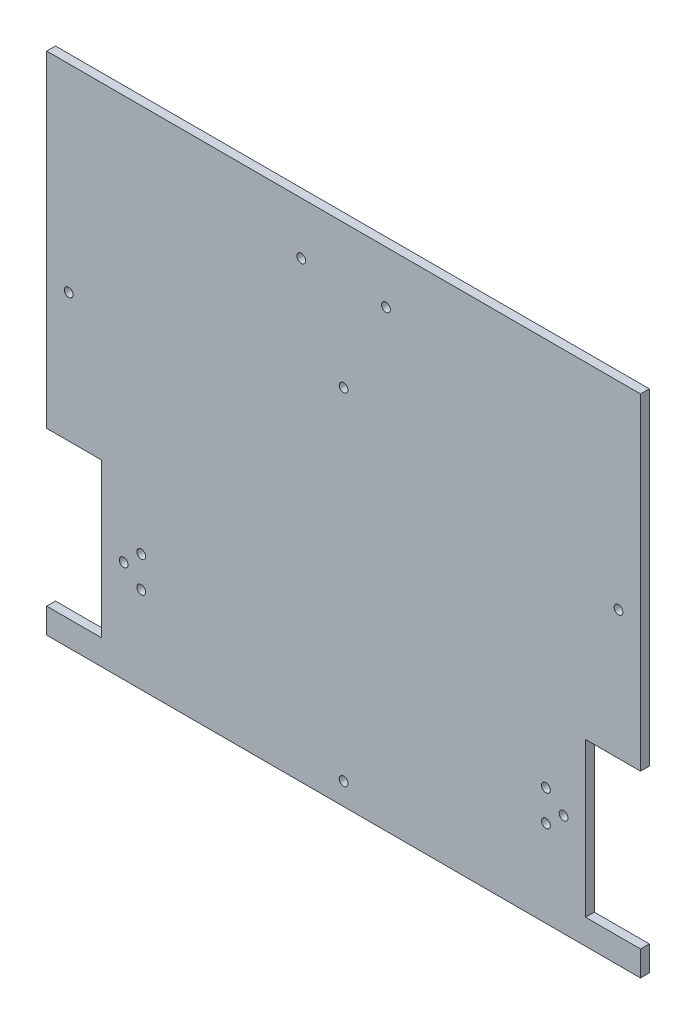
ISO-10303-21;
HEADER;
FILE_DESCRIPTION(('STEP AP214'),'2;1');
FILE_NAME('part.step','',(''),(''),'','','');
FILE_SCHEMA(('AUTOMOTIVE_DESIGN { 1 0 10303 214 1 1 1 1 }'));
ENDSEC;
DATA;
#1=APPLICATION_CONTEXT('core data for automotive mechanical design processes');
#2=APPLICATION_PROTOCOL_DEFINITION('international standard','automotive_design',2000,#1);
#3=PRODUCT_CONTEXT('',#1,'mechanical');
#4=PRODUCT('Part','Part','',(#3));
#5=PRODUCT_RELATED_PRODUCT_CATEGORY('part','',(#4));
#6=PRODUCT_DEFINITION_FORMATION('','',#4);
#7=PRODUCT_DEFINITION_CONTEXT('part definition',#1,'design');
#8=PRODUCT_DEFINITION('design','',#6,#7);
#9=PRODUCT_DEFINITION_SHAPE('','',#8);
#10=(LENGTH_UNIT() NAMED_UNIT(*) SI_UNIT(.MILLI.,.METRE.));
#11=(NAMED_UNIT(*) PLANE_ANGLE_UNIT() SI_UNIT($,.RADIAN.));
#12=(NAMED_UNIT(*) SI_UNIT($,.STERADIAN.) SOLID_ANGLE_UNIT());
#13=UNCERTAINTY_MEASURE_WITH_UNIT(LENGTH_MEASURE(1.E-05),#10,'distance_accuracy_value','');
#14=(GEOMETRIC_REPRESENTATION_CONTEXT(3) GLOBAL_UNCERTAINTY_ASSIGNED_CONTEXT((#13)) GLOBAL_UNIT_ASSIGNED_CONTEXT((#10,
#11,#12)) REPRESENTATION_CONTEXT('',''));
#15=CARTESIAN_POINT('',(0.,0.,0.));
#16=DIRECTION('',(0.,0.,1.));
#17=DIRECTION('',(1.,0.,0.));
#18=AXIS2_PLACEMENT_3D('',#15,#16,#17);
#19=CARTESIAN_POINT('',(135.,0.,4.));
#20=DIRECTION('',(-1.,0.,0.));
#21=DIRECTION('',(0.,0.,1.));
#22=AXIS2_PLACEMENT_3D('',#19,#20,#21);
#23=PLANE('',#22);
#24=DIRECTION('',(0.,0.,1.));
#25=VECTOR('',#24,1.);
#26=CARTESIAN_POINT('',(135.,81.4303347963324,-6.));
#27=LINE('',#26,#25);
#28=CARTESIAN_POINT('',(135.,81.4303347963324,0.));
#29=VERTEX_POINT('',#28);
#30=CARTESIAN_POINT('',(135.,81.4303347963324,4.));
#31=VERTEX_POINT('',#30);
#32=EDGE_CURVE('E136',#29,#31,#27,.T.);
#33=ORIENTED_EDGE('',*,*,#32,.F.);
#34=DIRECTION('',(0.,1.,0.));
#35=VECTOR('',#34,1.);
#36=CARTESIAN_POINT('',(135.,0.,0.));
#37=LINE('',#36,#35);
#38=CARTESIAN_POINT('',(135.,230.,0.));
#39=VERTEX_POINT('',#38);
#40=EDGE_CURVE('E189',#29,#39,#37,.T.);
#41=ORIENTED_EDGE('',*,*,#40,.T.);
#42=DIRECTION('',(0.,0.,-1.));
#43=VECTOR('',#42,1.);
#44=CARTESIAN_POINT('',(135.,230.,4.));
#45=LINE('',#44,#43);
#46=CARTESIAN_POINT('',(135.,230.,4.));
#47=VERTEX_POINT('',#46);
#48=EDGE_CURVE('E163',#47,#39,#45,.T.);
#49=ORIENTED_EDGE('',*,*,#48,.F.);
#50=DIRECTION('',(0.,1.,0.));
#51=VECTOR('',#50,1.);
#52=CARTESIAN_POINT('',(135.,0.,4.));
#53=LINE('',#52,#51);
#54=EDGE_CURVE('E151',#31,#47,#53,.T.);
#55=ORIENTED_EDGE('',*,*,#54,.F.);
#56=EDGE_LOOP('',(#33,#41,#49,#55));
#57=FACE_BOUND('',#56,.T.);
#58=ADVANCED_FACE('F44',(#57),#23,.F.);
#59=CARTESIAN_POINT('',(0.,0.,4.));
#60=DIRECTION('',(0.,0.,1.));
#61=DIRECTION('',(1.,0.,0.));
#62=AXIS2_PLACEMENT_3D('',#59,#60,#61);
#63=PLANE('',#62);
#64=CARTESIAN_POINT('',(-92.,53.4303347963325,4.));
#65=DIRECTION('',(0.,0.,-1.));
#66=DIRECTION('',(-1.,0.,0.));
#67=AXIS2_PLACEMENT_3D('',#64,#65,#66);
#68=CIRCLE('',#67,2.);
#69=CARTESIAN_POINT('',(-94.,53.4303347963325,4.));
#70=VERTEX_POINT('',#69);
#71=EDGE_CURVE('E261',#70,#70,#68,.T.);
#72=ORIENTED_EDGE('',*,*,#71,.T.);
#73=EDGE_LOOP('',(#72));
#74=FACE_BOUND('',#73,.T.);
#75=CARTESIAN_POINT('',(-92.,39.4303347963325,4.));
#76=DIRECTION('',(0.,0.,-1.));
#77=DIRECTION('',(-1.,0.,0.));
#78=AXIS2_PLACEMENT_3D('',#75,#76,#77);
#79=CIRCLE('',#78,2.);
#80=CARTESIAN_POINT('',(-94.,39.4303347963325,4.));
#81=VERTEX_POINT('',#80);
#82=EDGE_CURVE('E269',#81,#81,#79,.T.);
#83=ORIENTED_EDGE('',*,*,#82,.T.);
#84=EDGE_LOOP('',(#83));
#85=FACE_BOUND('',#84,.T.);
#86=CARTESIAN_POINT('',(92.,53.4303347963325,4.));
#87=DIRECTION('',(0.,0.,1.));
#88=DIRECTION('',(1.,0.,0.));
#89=AXIS2_PLACEMENT_3D('',#86,#87,#88);
#90=CIRCLE('',#89,2.);
#91=CARTESIAN_POINT('',(94.,53.4303347963325,4.));
#92=VERTEX_POINT('',#91);
#93=EDGE_CURVE('E258',#92,#92,#90,.T.);
#94=ORIENTED_EDGE('',*,*,#93,.F.);
#95=EDGE_LOOP('',(#94));
#96=FACE_BOUND('',#95,.T.);
#97=CARTESIAN_POINT('',(92.,39.4303347963325,4.));
#98=DIRECTION('',(0.,0.,1.));
#99=DIRECTION('',(1.,0.,0.));
#100=AXIS2_PLACEMENT_3D('',#97,#98,#99);
#101=CIRCLE('',#100,2.);
#102=CARTESIAN_POINT('',(94.,39.4303347963325,4.));
#103=VERTEX_POINT('',#102);
#104=EDGE_CURVE('E268',#103,#103,#101,.T.);
#105=ORIENTED_EDGE('',*,*,#104,.F.);
#106=EDGE_LOOP('',(#105));
#107=FACE_BOUND('',#106,.T.);
#108=CARTESIAN_POINT('',(0.,165.,4.));
#109=DIRECTION('',(0.,0.,1.));
#110=DIRECTION('',(1.,0.,0.));
#111=AXIS2_PLACEMENT_3D('',#108,#109,#110);
#112=CIRCLE('',#111,2.);
#113=CARTESIAN_POINT('',(1.99999999999993,165.,4.));
#114=VERTEX_POINT('',#113);
#115=EDGE_CURVE('E249',#114,#114,#112,.T.);
#116=ORIENTED_EDGE('',*,*,#115,.F.);
#117=EDGE_LOOP('',(#116));
#118=FACE_BOUND('',#117,.T.);
#119=CARTESIAN_POINT('',(-125.,140.,4.));
#120=DIRECTION('',(0.,0.,1.));
#121=DIRECTION('',(1.,0.,0.));
#122=AXIS2_PLACEMENT_3D('',#119,#120,#121);
#123=CIRCLE('',#122,2.);
#124=CARTESIAN_POINT('',(-123.,140.,4.));
#125=VERTEX_POINT('',#124);
#126=EDGE_CURVE('E236',#125,#125,#123,.T.);
#127=ORIENTED_EDGE('',*,*,#126,.F.);
#128=EDGE_LOOP('',(#127));
#129=FACE_BOUND('',#128,.T.);
#130=CARTESIAN_POINT('',(125.,140.,4.));
#131=DIRECTION('',(0.,0.,1.));
#132=DIRECTION('',(1.,0.,0.));
#133=AXIS2_PLACEMENT_3D('',#130,#131,#132);
#134=CIRCLE('',#133,2.);
#135=CARTESIAN_POINT('',(127.,140.,4.));
#136=VERTEX_POINT('',#135);
#137=EDGE_CURVE('E289',#136,#136,#134,.T.);
#138=ORIENTED_EDGE('',*,*,#137,.F.);
#139=EDGE_LOOP('',(#138));
#140=FACE_BOUND('',#139,.T.);
#141=CARTESIAN_POINT('',(0.,9.99999999999997,4.));
#142=DIRECTION('',(0.,0.,1.));
#143=DIRECTION('',(1.,0.,0.));
#144=AXIS2_PLACEMENT_3D('',#141,#142,#143);
#145=CIRCLE('',#144,2.);
#146=CARTESIAN_POINT('',(1.99999999999995,9.99999999999997,4.));
#147=VERTEX_POINT('',#146);
#148=EDGE_CURVE('E248',#147,#147,#145,.T.);
#149=ORIENTED_EDGE('',*,*,#148,.F.);
#150=EDGE_LOOP('',(#149));
#151=FACE_BOUND('',#150,.T.);
#152=CARTESIAN_POINT('',(19.25,206.268311878249,4.));
#153=DIRECTION('',(0.,0.,1.));
#154=DIRECTION('',(1.,0.,0.));
#155=AXIS2_PLACEMENT_3D('',#152,#153,#154);
#156=CIRCLE('',#155,2.);
#157=CARTESIAN_POINT('',(21.25,206.268311878249,4.));
#158=VERTEX_POINT('',#157);
#159=EDGE_CURVE('E308',#158,#158,#156,.T.);
#160=ORIENTED_EDGE('',*,*,#159,.F.);
#161=EDGE_LOOP('',(#160));
#162=FACE_BOUND('',#161,.T.);
#163=CARTESIAN_POINT('',(-19.25,206.268311878249,4.));
#164=DIRECTION('',(0.,0.,1.));
#165=DIRECTION('',(1.,0.,0.));
#166=AXIS2_PLACEMENT_3D('',#163,#164,#165);
#167=CIRCLE('',#166,2.);
#168=CARTESIAN_POINT('',(-17.25,206.268311878249,4.));
#169=VERTEX_POINT('',#168);
#170=EDGE_CURVE('E301',#169,#169,#167,.T.);
#171=ORIENTED_EDGE('',*,*,#170,.F.);
#172=EDGE_LOOP('',(#171));
#173=FACE_BOUND('',#172,.T.);
#174=CARTESIAN_POINT('',(100.,46.4303347963325,4.));
#175=DIRECTION('',(0.,0.,1.));
#176=DIRECTION('',(1.,0.,0.));
#177=AXIS2_PLACEMENT_3D('',#174,#175,#176);
#178=CIRCLE('',#177,2.);
#179=CARTESIAN_POINT('',(102.,46.4303347963325,4.));
#180=VERTEX_POINT('',#179);
#181=EDGE_CURVE('E158',#180,#180,#178,.T.);
#182=ORIENTED_EDGE('',*,*,#181,.F.);
#183=EDGE_LOOP('',(#182));
#184=FACE_BOUND('',#183,.T.);
#185=CARTESIAN_POINT('',(-100.,46.1864280883171,4.));
#186=DIRECTION('',(0.,0.,1.));
#187=DIRECTION('',(1.,0.,0.));
#188=AXIS2_PLACEMENT_3D('',#185,#186,#187);
#189=CIRCLE('',#188,2.);
#190=CARTESIAN_POINT('',(-98.0000000000001,46.1864280883171,4.));
#191=VERTEX_POINT('',#190);
#192=EDGE_CURVE('E320',#191,#191,#189,.T.);
#193=ORIENTED_EDGE('',*,*,#192,.F.);
#194=EDGE_LOOP('',(#193));
#195=FACE_BOUND('',#194,.T.);
#196=DIRECTION('',(0.,1.,0.));
#197=VECTOR('',#196,1.);
#198=CARTESIAN_POINT('',(110.,11.4303347963324,4.));
#199=LINE('',#198,#197);
#200=CARTESIAN_POINT('',(110.,11.4303347963324,4.));
#201=VERTEX_POINT('',#200);
#202=CARTESIAN_POINT('',(110.,81.4303347963324,4.));
#203=VERTEX_POINT('',#202);
#204=EDGE_CURVE('E152',#201,#203,#199,.T.);
#205=ORIENTED_EDGE('',*,*,#204,.T.);
#206=DIRECTION('',(1.,0.,0.));
#207=VECTOR('',#206,1.);
#208=CARTESIAN_POINT('',(110.,81.4303347963324,4.));
#209=LINE('',#208,#207);
#210=EDGE_CURVE('E139',#203,#31,#209,.T.);
#211=ORIENTED_EDGE('',*,*,#210,.T.);
#212=ORIENTED_EDGE('',*,*,#54,.T.);
#213=DIRECTION('',(-1.,0.,0.));
#214=VECTOR('',#213,1.);
#215=CARTESIAN_POINT('',(135.,230.,4.));
#216=LINE('',#215,#214);
#217=CARTESIAN_POINT('',(-135.,230.,4.));
#218=VERTEX_POINT('',#217);
#219=EDGE_CURVE('E167',#47,#218,#216,.T.);
#220=ORIENTED_EDGE('',*,*,#219,.T.);
#221=DIRECTION('',(0.,-1.,0.));
#222=VECTOR('',#221,1.);
#223=CARTESIAN_POINT('',(-135.,230.,4.));
#224=LINE('',#223,#222);
#225=CARTESIAN_POINT('',(-135.,81.4303347963324,4.));
#226=VERTEX_POINT('',#225);
#227=EDGE_CURVE('E177',#218,#226,#224,.T.);
#228=ORIENTED_EDGE('',*,*,#227,.T.);
#229=DIRECTION('',(-1.,0.,0.));
#230=VECTOR('',#229,1.);
#231=CARTESIAN_POINT('',(-110.,81.4303347963324,4.));
#232=LINE('',#231,#230);
#233=CARTESIAN_POINT('',(-110.,81.4303347963324,4.));
#234=VERTEX_POINT('',#233);
#235=EDGE_CURVE('E341',#234,#226,#232,.T.);
#236=ORIENTED_EDGE('',*,*,#235,.F.);
#237=DIRECTION('',(0.,1.,0.));
#238=VECTOR('',#237,1.);
#239=CARTESIAN_POINT('',(-110.,11.4303347963325,4.));
#240=LINE('',#239,#238);
#241=CARTESIAN_POINT('',(-110.,11.4303347963325,4.));
#242=VERTEX_POINT('',#241);
#243=EDGE_CURVE('E343',#242,#234,#240,.T.);
#244=ORIENTED_EDGE('',*,*,#243,.F.);
#245=DIRECTION('',(1.,0.,0.));
#246=VECTOR('',#245,1.);
#247=CARTESIAN_POINT('',(-135.,11.4303347963325,4.));
#248=LINE('',#247,#246);
#249=CARTESIAN_POINT('',(-135.,11.4303347963325,4.));
#250=VERTEX_POINT('',#249);
#251=EDGE_CURVE('E149',#250,#242,#248,.T.);
#252=ORIENTED_EDGE('',*,*,#251,.F.);
#253=CARTESIAN_POINT('',(-135.,0.,4.));
#254=VERTEX_POINT('',#253);
#255=EDGE_CURVE('E178',#250,#254,#224,.T.);
#256=ORIENTED_EDGE('',*,*,#255,.T.);
#257=DIRECTION('',(1.,0.,0.));
#258=VECTOR('',#257,1.);
#259=CARTESIAN_POINT('',(-135.,0.,4.));
#260=LINE('',#259,#258);
#261=CARTESIAN_POINT('',(135.,0.,4.));
#262=VERTEX_POINT('',#261);
#263=EDGE_CURVE('E164',#254,#262,#260,.T.);
#264=ORIENTED_EDGE('',*,*,#263,.T.);
#265=CARTESIAN_POINT('',(135.,11.4303347963324,4.));
#266=VERTEX_POINT('',#265);
#267=EDGE_CURVE('E165',#262,#266,#53,.T.);
#268=ORIENTED_EDGE('',*,*,#267,.T.);
#269=DIRECTION('',(-1.,0.,0.));
#270=VECTOR('',#269,1.);
#271=CARTESIAN_POINT('',(135.,11.4303347963324,4.));
#272=LINE('',#271,#270);
#273=EDGE_CURVE('E160',#266,#201,#272,.T.);
#274=ORIENTED_EDGE('',*,*,#273,.T.);
#275=EDGE_LOOP('',(#205,#211,#212,#220,#228,#236,#244,#252,#256,#264,#268,#274));
#276=FACE_BOUND('',#275,.T.);
#277=ADVANCED_FACE('F154',(#74,#85,#96,#107,#118,#129,#140,#151,#162,#173,#184,#195,#276),#63,.T.);
#278=CARTESIAN_POINT('',(0.,0.,0.));
#279=DIRECTION('',(0.,0.,1.));
#280=DIRECTION('',(1.,0.,0.));
#281=AXIS2_PLACEMENT_3D('',#278,#279,#280);
#282=PLANE('',#281);
#283=CARTESIAN_POINT('',(-92.,53.4303347963325,0.));
#284=DIRECTION('',(0.,0.,1.));
#285=DIRECTION('',(1.,0.,0.));
#286=AXIS2_PLACEMENT_3D('',#283,#284,#285);
#287=CIRCLE('',#286,2.);
#288=CARTESIAN_POINT('',(-90.,53.4303347963325,0.));
#289=VERTEX_POINT('',#288);
#290=EDGE_CURVE('E47',#289,#289,#287,.F.);
#291=ORIENTED_EDGE('',*,*,#290,.F.);
#292=EDGE_LOOP('',(#291));
#293=FACE_BOUND('',#292,.T.);
#294=CARTESIAN_POINT('',(-92.,39.4303347963325,0.));
#295=DIRECTION('',(0.,0.,1.));
#296=DIRECTION('',(1.,0.,0.));
#297=AXIS2_PLACEMENT_3D('',#294,#295,#296);
#298=CIRCLE('',#297,2.);
#299=CARTESIAN_POINT('',(-90.,39.4303347963325,0.));
#300=VERTEX_POINT('',#299);
#301=EDGE_CURVE('E260',#300,#300,#298,.F.);
#302=ORIENTED_EDGE('',*,*,#301,.F.);
#303=EDGE_LOOP('',(#302));
#304=FACE_BOUND('',#303,.T.);
#305=CARTESIAN_POINT('',(92.,53.4303347963325,0.));
#306=DIRECTION('',(0.,0.,1.));
#307=DIRECTION('',(1.,0.,0.));
#308=AXIS2_PLACEMENT_3D('',#305,#306,#307);
#309=CIRCLE('',#308,2.);
#310=CARTESIAN_POINT('',(94.,53.4303347963325,0.));
#311=VERTEX_POINT('',#310);
#312=EDGE_CURVE('E253',#311,#311,#309,.T.);
#313=ORIENTED_EDGE('',*,*,#312,.T.);
#314=EDGE_LOOP('',(#313));
#315=FACE_BOUND('',#314,.T.);
#316=CARTESIAN_POINT('',(92.,39.4303347963325,0.));
#317=DIRECTION('',(0.,0.,1.));
#318=DIRECTION('',(1.,0.,0.));
#319=AXIS2_PLACEMENT_3D('',#316,#317,#318);
#320=CIRCLE('',#319,2.);
#321=CARTESIAN_POINT('',(94.,39.4303347963325,0.));
#322=VERTEX_POINT('',#321);
#323=EDGE_CURVE('E252',#322,#322,#320,.T.);
#324=ORIENTED_EDGE('',*,*,#323,.T.);
#325=EDGE_LOOP('',(#324));
#326=FACE_BOUND('',#325,.T.);
#327=CARTESIAN_POINT('',(0.,165.,0.));
#328=DIRECTION('',(0.,0.,1.));
#329=DIRECTION('',(1.,0.,0.));
#330=AXIS2_PLACEMENT_3D('',#327,#328,#329);
#331=CIRCLE('',#330,2.);
#332=CARTESIAN_POINT('',(1.99999999999993,165.,0.));
#333=VERTEX_POINT('',#332);
#334=EDGE_CURVE('E244',#333,#333,#331,.T.);
#335=ORIENTED_EDGE('',*,*,#334,.T.);
#336=EDGE_LOOP('',(#335));
#337=FACE_BOUND('',#336,.T.);
#338=CARTESIAN_POINT('',(-125.,140.,0.));
#339=DIRECTION('',(0.,0.,1.));
#340=DIRECTION('',(1.,0.,0.));
#341=AXIS2_PLACEMENT_3D('',#338,#339,#340);
#342=CIRCLE('',#341,2.);
#343=CARTESIAN_POINT('',(-123.,140.,0.));
#344=VERTEX_POINT('',#343);
#345=EDGE_CURVE('E239',#344,#344,#342,.T.);
#346=ORIENTED_EDGE('',*,*,#345,.T.);
#347=EDGE_LOOP('',(#346));
#348=FACE_BOUND('',#347,.T.);
#349=CARTESIAN_POINT('',(125.,140.,0.));
#350=DIRECTION('',(0.,0.,1.));
#351=DIRECTION('',(1.,0.,0.));
#352=AXIS2_PLACEMENT_3D('',#349,#350,#351);
#353=CIRCLE('',#352,2.);
#354=CARTESIAN_POINT('',(127.,140.,0.));
#355=VERTEX_POINT('',#354);
#356=EDGE_CURVE('E232',#355,#355,#353,.T.);
#357=ORIENTED_EDGE('',*,*,#356,.T.);
#358=EDGE_LOOP('',(#357));
#359=FACE_BOUND('',#358,.T.);
#360=CARTESIAN_POINT('',(0.,9.99999999999997,0.));
#361=DIRECTION('',(0.,0.,1.));
#362=DIRECTION('',(1.,0.,0.));
#363=AXIS2_PLACEMENT_3D('',#360,#361,#362);
#364=CIRCLE('',#363,2.);
#365=CARTESIAN_POINT('',(1.99999999999995,9.99999999999997,0.));
#366=VERTEX_POINT('',#365);
#367=EDGE_CURVE('E233',#366,#366,#364,.T.);
#368=ORIENTED_EDGE('',*,*,#367,.T.);
#369=EDGE_LOOP('',(#368));
#370=FACE_BOUND('',#369,.T.);
#371=CARTESIAN_POINT('',(19.25,206.268311878249,0.));
#372=DIRECTION('',(0.,0.,-1.));
#373=DIRECTION('',(-1.,0.,0.));
#374=AXIS2_PLACEMENT_3D('',#371,#372,#373);
#375=CIRCLE('',#374,2.);
#376=CARTESIAN_POINT('',(17.25,206.268311878249,0.));
#377=VERTEX_POINT('',#376);
#378=EDGE_CURVE('E300',#377,#377,#375,.T.);
#379=ORIENTED_EDGE('',*,*,#378,.F.);
#380=EDGE_LOOP('',(#379));
#381=FACE_BOUND('',#380,.T.);
#382=CARTESIAN_POINT('',(-19.25,206.268311878249,0.));
#383=DIRECTION('',(0.,0.,-1.));
#384=DIRECTION('',(-1.,0.,0.));
#385=AXIS2_PLACEMENT_3D('',#382,#383,#384);
#386=CIRCLE('',#385,2.);
#387=CARTESIAN_POINT('',(-21.25,206.268311878249,0.));
#388=VERTEX_POINT('',#387);
#389=EDGE_CURVE('E242',#388,#388,#386,.T.);
#390=ORIENTED_EDGE('',*,*,#389,.F.);
#391=EDGE_LOOP('',(#390));
#392=FACE_BOUND('',#391,.T.);
#393=CARTESIAN_POINT('',(100.,46.4303347963325,0.));
#394=DIRECTION('',(0.,0.,-1.));
#395=DIRECTION('',(-1.,0.,0.));
#396=AXIS2_PLACEMENT_3D('',#393,#394,#395);
#397=CIRCLE('',#396,2.);
#398=CARTESIAN_POINT('',(98.,46.4303347963325,0.));
#399=VERTEX_POINT('',#398);
#400=EDGE_CURVE('E312',#399,#399,#397,.T.);
#401=ORIENTED_EDGE('',*,*,#400,.F.);
#402=EDGE_LOOP('',(#401));
#403=FACE_BOUND('',#402,.T.);
#404=CARTESIAN_POINT('',(-100.,46.1864280883171,0.));
#405=DIRECTION('',(0.,0.,-1.));
#406=DIRECTION('',(-1.,0.,0.));
#407=AXIS2_PLACEMENT_3D('',#404,#405,#406);
#408=CIRCLE('',#407,2.);
#409=CARTESIAN_POINT('',(-102.,46.1864280883171,0.));
#410=VERTEX_POINT('',#409);
#411=EDGE_CURVE('E315',#410,#410,#408,.T.);
#412=ORIENTED_EDGE('',*,*,#411,.F.);
#413=EDGE_LOOP('',(#412));
#414=FACE_BOUND('',#413,.T.);
#415=DIRECTION('',(1.,0.,0.));
#416=VECTOR('',#415,1.);
#417=CARTESIAN_POINT('',(0.,81.4303347963324,0.));
#418=LINE('',#417,#416);
#419=CARTESIAN_POINT('',(110.,81.4303347963324,0.));
#420=VERTEX_POINT('',#419);
#421=EDGE_CURVE('E11',#420,#29,#418,.T.);
#422=ORIENTED_EDGE('',*,*,#421,.F.);
#423=DIRECTION('',(0.,1.,0.));
#424=VECTOR('',#423,1.);
#425=CARTESIAN_POINT('',(110.,0.,0.));
#426=LINE('',#425,#424);
#427=CARTESIAN_POINT('',(110.,11.4303347963324,0.));
#428=VERTEX_POINT('',#427);
#429=EDGE_CURVE('E228',#428,#420,#426,.T.);
#430=ORIENTED_EDGE('',*,*,#429,.F.);
#431=DIRECTION('',(-1.,0.,0.));
#432=VECTOR('',#431,1.);
#433=CARTESIAN_POINT('',(0.,11.4303347963324,0.));
#434=LINE('',#433,#432);
#435=CARTESIAN_POINT('',(135.,11.4303347963324,0.));
#436=VERTEX_POINT('',#435);
#437=EDGE_CURVE('E54',#436,#428,#434,.T.);
#438=ORIENTED_EDGE('',*,*,#437,.F.);
#439=CARTESIAN_POINT('',(135.,0.,0.));
#440=VERTEX_POINT('',#439);
#441=EDGE_CURVE('E188',#440,#436,#37,.T.);
#442=ORIENTED_EDGE('',*,*,#441,.F.);
#443=DIRECTION('',(1.,0.,0.));
#444=VECTOR('',#443,1.);
#445=CARTESIAN_POINT('',(-135.,0.,0.));
#446=LINE('',#445,#444);
#447=CARTESIAN_POINT('',(-135.,0.,0.));
#448=VERTEX_POINT('',#447);
#449=EDGE_CURVE('E183',#448,#440,#446,.T.);
#450=ORIENTED_EDGE('',*,*,#449,.F.);
#451=DIRECTION('',(0.,-1.,0.));
#452=VECTOR('',#451,1.);
#453=CARTESIAN_POINT('',(-135.,230.,0.));
#454=LINE('',#453,#452);
#455=CARTESIAN_POINT('',(-135.,11.4303347963325,0.));
#456=VERTEX_POINT('',#455);
#457=EDGE_CURVE('E196',#456,#448,#454,.T.);
#458=ORIENTED_EDGE('',*,*,#457,.F.);
#459=DIRECTION('',(1.,0.,0.));
#460=VECTOR('',#459,1.);
#461=CARTESIAN_POINT('',(0.,11.4303347963324,0.));
#462=LINE('',#461,#460);
#463=CARTESIAN_POINT('',(-110.,11.4303347963325,0.));
#464=VERTEX_POINT('',#463);
#465=EDGE_CURVE('E215',#456,#464,#462,.T.);
#466=ORIENTED_EDGE('',*,*,#465,.T.);
#467=DIRECTION('',(0.,1.,0.));
#468=VECTOR('',#467,1.);
#469=CARTESIAN_POINT('',(-110.,0.,0.));
#470=LINE('',#469,#468);
#471=CARTESIAN_POINT('',(-110.,81.4303347963324,0.));
#472=VERTEX_POINT('',#471);
#473=EDGE_CURVE('E220',#464,#472,#470,.T.);
#474=ORIENTED_EDGE('',*,*,#473,.T.);
#475=DIRECTION('',(-1.,0.,0.));
#476=VECTOR('',#475,1.);
#477=CARTESIAN_POINT('',(0.,81.4303347963325,0.));
#478=LINE('',#477,#476);
#479=CARTESIAN_POINT('',(-135.,81.4303347963324,0.));
#480=VERTEX_POINT('',#479);
#481=EDGE_CURVE('E225',#472,#480,#478,.T.);
#482=ORIENTED_EDGE('',*,*,#481,.T.);
#483=CARTESIAN_POINT('',(-135.,230.,0.));
#484=VERTEX_POINT('',#483);
#485=EDGE_CURVE('E175',#484,#480,#454,.T.);
#486=ORIENTED_EDGE('',*,*,#485,.F.);
#487=DIRECTION('',(-1.,0.,0.));
#488=VECTOR('',#487,1.);
#489=CARTESIAN_POINT('',(135.,230.,0.));
#490=LINE('',#489,#488);
#491=EDGE_CURVE('E195',#39,#484,#490,.T.);
#492=ORIENTED_EDGE('',*,*,#491,.F.);
#493=ORIENTED_EDGE('',*,*,#40,.F.);
#494=EDGE_LOOP('',(#422,#430,#438,#442,#450,#458,#466,#474,#482,#486,#492,#493));
#495=FACE_BOUND('',#494,.T.);
#496=ADVANCED_FACE('F378',(#293,#304,#315,#326,#337,#348,#359,#370,#381,#392,#403,#414,#495),
#282,.F.);
#497=CARTESIAN_POINT('',(-135.,230.,4.));
#498=DIRECTION('',(1.,0.,0.));
#499=DIRECTION('',(0.,1.,0.));
#500=AXIS2_PLACEMENT_3D('',#497,#498,#499);
#501=PLANE('',#500);
#502=DIRECTION('',(0.,0.,1.));
#503=VECTOR('',#502,1.);
#504=CARTESIAN_POINT('',(-135.,11.4303347963325,-6.));
#505=LINE('',#504,#503);
#506=EDGE_CURVE('E350',#456,#250,#505,.T.);
#507=ORIENTED_EDGE('',*,*,#506,.F.);
#508=ORIENTED_EDGE('',*,*,#457,.T.);
#509=DIRECTION('',(0.,0.,-1.));
#510=VECTOR('',#509,1.);
#511=CARTESIAN_POINT('',(-135.,0.,4.));
#512=LINE('',#511,#510);
#513=EDGE_CURVE('E182',#254,#448,#512,.T.);
#514=ORIENTED_EDGE('',*,*,#513,.F.);
#515=ORIENTED_EDGE('',*,*,#255,.F.);
#516=EDGE_LOOP('',(#507,#508,#514,#515));
#517=FACE_BOUND('',#516,.T.);
#518=ADVANCED_FACE('F366',(#517),#501,.F.);
#519=CARTESIAN_POINT('',(-135.,0.,4.));
#520=DIRECTION('',(0.,1.,0.));
#521=DIRECTION('',(0.,0.,1.));
#522=AXIS2_PLACEMENT_3D('',#519,#520,#521);
#523=PLANE('',#522);
#524=ORIENTED_EDGE('',*,*,#449,.T.);
#525=DIRECTION('',(0.,0.,-1.));
#526=VECTOR('',#525,1.);
#527=CARTESIAN_POINT('',(135.,0.,4.));
#528=LINE('',#527,#526);
#529=EDGE_CURVE('E208',#262,#440,#528,.T.);
#530=ORIENTED_EDGE('',*,*,#529,.F.);
#531=ORIENTED_EDGE('',*,*,#263,.F.);
#532=ORIENTED_EDGE('',*,*,#513,.T.);
#533=EDGE_LOOP('',(#524,#530,#531,#532));
#534=FACE_BOUND('',#533,.T.);
#535=ADVANCED_FACE('F50',(#534),#523,.F.);
#536=ORIENTED_EDGE('',*,*,#441,.T.);
#537=DIRECTION('',(0.,0.,1.));
#538=VECTOR('',#537,1.);
#539=CARTESIAN_POINT('',(135.,11.4303347963324,-6.));
#540=LINE('',#539,#538);
#541=EDGE_CURVE('E147',#436,#266,#540,.T.);
#542=ORIENTED_EDGE('',*,*,#541,.T.);
#543=ORIENTED_EDGE('',*,*,#267,.F.);
#544=ORIENTED_EDGE('',*,*,#529,.T.);
#545=EDGE_LOOP('',(#536,#542,#543,#544));
#546=FACE_BOUND('',#545,.T.);
#547=ADVANCED_FACE('F373',(#546),#23,.F.);
#548=CARTESIAN_POINT('',(135.,230.,4.));
#549=DIRECTION('',(0.,-1.,0.));
#550=DIRECTION('',(1.,0.,0.));
#551=AXIS2_PLACEMENT_3D('',#548,#549,#550);
#552=PLANE('',#551);
#553=ORIENTED_EDGE('',*,*,#491,.T.);
#554=DIRECTION('',(0.,0.,-1.));
#555=VECTOR('',#554,1.);
#556=CARTESIAN_POINT('',(-135.,230.,4.));
#557=LINE('',#556,#555);
#558=EDGE_CURVE('E202',#218,#484,#557,.T.);
#559=ORIENTED_EDGE('',*,*,#558,.F.);
#560=ORIENTED_EDGE('',*,*,#219,.F.);
#561=ORIENTED_EDGE('',*,*,#48,.T.);
#562=EDGE_LOOP('',(#553,#559,#560,#561));
#563=FACE_BOUND('',#562,.T.);
#564=ADVANCED_FACE('F399',(#563),#552,.F.);
#565=ORIENTED_EDGE('',*,*,#485,.T.);
#566=DIRECTION('',(0.,0.,1.));
#567=VECTOR('',#566,1.);
#568=CARTESIAN_POINT('',(-135.,81.4303347963324,-6.));
#569=LINE('',#568,#567);
#570=EDGE_CURVE('E186',#480,#226,#569,.T.);
#571=ORIENTED_EDGE('',*,*,#570,.T.);
#572=ORIENTED_EDGE('',*,*,#227,.F.);
#573=ORIENTED_EDGE('',*,*,#558,.T.);
#574=EDGE_LOOP('',(#565,#571,#572,#573));
#575=FACE_BOUND('',#574,.T.);
#576=ADVANCED_FACE('F403',(#575),#501,.F.);
#577=CARTESIAN_POINT('',(-110.,81.4303347963324,-6.));
#578=DIRECTION('',(0.,1.,0.));
#579=DIRECTION('',(-1.,0.,0.));
#580=AXIS2_PLACEMENT_3D('',#577,#578,#579);
#581=PLANE('',#580);
#582=DIRECTION('',(0.,0.,1.));
#583=VECTOR('',#582,1.);
#584=CARTESIAN_POINT('',(-110.,81.4303347963324,-6.));
#585=LINE('',#584,#583);
#586=EDGE_CURVE('E355',#472,#234,#585,.T.);
#587=ORIENTED_EDGE('',*,*,#586,.T.);
#588=ORIENTED_EDGE('',*,*,#235,.T.);
#589=ORIENTED_EDGE('',*,*,#570,.F.);
#590=ORIENTED_EDGE('',*,*,#481,.F.);
#591=EDGE_LOOP('',(#587,#588,#589,#590));
#592=FACE_BOUND('',#591,.T.);
#593=ADVANCED_FACE('F418',(#592),#581,.F.);
#594=CARTESIAN_POINT('',(-110.,11.4303347963325,-6.));
#595=DIRECTION('',(1.,0.,0.));
#596=DIRECTION('',(0.,0.,-1.));
#597=AXIS2_PLACEMENT_3D('',#594,#595,#596);
#598=PLANE('',#597);
#599=DIRECTION('',(0.,0.,1.));
#600=VECTOR('',#599,1.);
#601=CARTESIAN_POINT('',(-110.,11.4303347963325,-6.));
#602=LINE('',#601,#600);
#603=EDGE_CURVE('E71',#464,#242,#602,.T.);
#604=ORIENTED_EDGE('',*,*,#603,.T.);
#605=ORIENTED_EDGE('',*,*,#243,.T.);
#606=ORIENTED_EDGE('',*,*,#586,.F.);
#607=ORIENTED_EDGE('',*,*,#473,.F.);
#608=EDGE_LOOP('',(#604,#605,#606,#607));
#609=FACE_BOUND('',#608,.T.);
#610=ADVANCED_FACE('F421',(#609),#598,.F.);
#611=CARTESIAN_POINT('',(-135.,11.4303347963325,-6.));
#612=DIRECTION('',(0.,-1.,0.));
#613=DIRECTION('',(1.,0.,0.));
#614=AXIS2_PLACEMENT_3D('',#611,#612,#613);
#615=PLANE('',#614);
#616=ORIENTED_EDGE('',*,*,#506,.T.);
#617=ORIENTED_EDGE('',*,*,#251,.T.);
#618=ORIENTED_EDGE('',*,*,#603,.F.);
#619=ORIENTED_EDGE('',*,*,#465,.F.);
#620=EDGE_LOOP('',(#616,#617,#618,#619));
#621=FACE_BOUND('',#620,.T.);
#622=ADVANCED_FACE('F360',(#621),#615,.F.);
#623=CARTESIAN_POINT('',(110.,81.4303347963324,-6.));
#624=DIRECTION('',(0.,-1.,0.));
#625=DIRECTION('',(0.,0.,-1.));
#626=AXIS2_PLACEMENT_3D('',#623,#624,#625);
#627=PLANE('',#626);
#628=ORIENTED_EDGE('',*,*,#421,.T.);
#629=ORIENTED_EDGE('',*,*,#32,.T.);
#630=ORIENTED_EDGE('',*,*,#210,.F.);
#631=DIRECTION('',(0.,0.,1.));
#632=VECTOR('',#631,1.);
#633=CARTESIAN_POINT('',(110.,81.4303347963324,-6.));
#634=LINE('',#633,#632);
#635=EDGE_CURVE('E331',#420,#203,#634,.T.);
#636=ORIENTED_EDGE('',*,*,#635,.F.);
#637=EDGE_LOOP('',(#628,#629,#630,#636));
#638=FACE_BOUND('',#637,.T.);
#639=ADVANCED_FACE('F138',(#638),#627,.T.);
#640=CARTESIAN_POINT('',(135.,11.4303347963324,-6.));
#641=DIRECTION('',(0.,1.,0.));
#642=DIRECTION('',(-1.,0.,0.));
#643=AXIS2_PLACEMENT_3D('',#640,#641,#642);
#644=PLANE('',#643);
#645=ORIENTED_EDGE('',*,*,#437,.T.);
#646=DIRECTION('',(0.,0.,1.));
#647=VECTOR('',#646,1.);
#648=CARTESIAN_POINT('',(110.,11.4303347963324,-6.));
#649=LINE('',#648,#647);
#650=EDGE_CURVE('E62',#428,#201,#649,.T.);
#651=ORIENTED_EDGE('',*,*,#650,.T.);
#652=ORIENTED_EDGE('',*,*,#273,.F.);
#653=ORIENTED_EDGE('',*,*,#541,.F.);
#654=EDGE_LOOP('',(#645,#651,#652,#653));
#655=FACE_BOUND('',#654,.T.);
#656=ADVANCED_FACE('F376',(#655),#644,.T.);
#657=CARTESIAN_POINT('',(110.,11.4303347963324,-6.));
#658=DIRECTION('',(1.,0.,0.));
#659=DIRECTION('',(0.,0.,-1.));
#660=AXIS2_PLACEMENT_3D('',#657,#658,#659);
#661=PLANE('',#660);
#662=ORIENTED_EDGE('',*,*,#429,.T.);
#663=ORIENTED_EDGE('',*,*,#635,.T.);
#664=ORIENTED_EDGE('',*,*,#204,.F.);
#665=ORIENTED_EDGE('',*,*,#650,.F.);
#666=EDGE_LOOP('',(#662,#663,#664,#665));
#667=FACE_BOUND('',#666,.T.);
#668=ADVANCED_FACE('F379',(#667),#661,.T.);
#669=CARTESIAN_POINT('',(-100.,46.1864280883171,10.));
#670=DIRECTION('',(0.,0.,-1.));
#671=DIRECTION('',(-1.,0.,0.));
#672=AXIS2_PLACEMENT_3D('',#669,#670,#671);
#673=CYLINDRICAL_SURFACE('',#672,2.);
#674=ORIENTED_EDGE('',*,*,#192,.T.);
#675=EDGE_LOOP('',(#674));
#676=FACE_BOUND('',#675,.T.);
#677=ORIENTED_EDGE('',*,*,#411,.T.);
#678=EDGE_LOOP('',(#677));
#679=FACE_BOUND('',#678,.T.);
#680=ADVANCED_FACE('F385',(#676,#679),#673,.F.);
#681=CARTESIAN_POINT('',(100.,46.4303347963325,10.));
#682=DIRECTION('',(0.,0.,-1.));
#683=DIRECTION('',(-1.,0.,0.));
#684=AXIS2_PLACEMENT_3D('',#681,#682,#683);
#685=CYLINDRICAL_SURFACE('',#684,2.);
#686=ORIENTED_EDGE('',*,*,#181,.T.);
#687=EDGE_LOOP('',(#686));
#688=FACE_BOUND('',#687,.T.);
#689=ORIENTED_EDGE('',*,*,#400,.T.);
#690=EDGE_LOOP('',(#689));
#691=FACE_BOUND('',#690,.T.);
#692=ADVANCED_FACE('F387',(#688,#691),#685,.F.);
#693=CARTESIAN_POINT('',(-19.25,206.268311878249,10.));
#694=DIRECTION('',(0.,0.,-1.));
#695=DIRECTION('',(-1.,0.,0.));
#696=AXIS2_PLACEMENT_3D('',#693,#694,#695);
#697=CYLINDRICAL_SURFACE('',#696,2.);
#698=ORIENTED_EDGE('',*,*,#170,.T.);
#699=EDGE_LOOP('',(#698));
#700=FACE_BOUND('',#699,.T.);
#701=ORIENTED_EDGE('',*,*,#389,.T.);
#702=EDGE_LOOP('',(#701));
#703=FACE_BOUND('',#702,.T.);
#704=ADVANCED_FACE('F466',(#700,#703),#697,.F.);
#705=CARTESIAN_POINT('',(19.25,206.268311878249,10.));
#706=DIRECTION('',(0.,0.,-1.));
#707=DIRECTION('',(-1.,0.,0.));
#708=AXIS2_PLACEMENT_3D('',#705,#706,#707);
#709=CYLINDRICAL_SURFACE('',#708,2.);
#710=ORIENTED_EDGE('',*,*,#159,.T.);
#711=EDGE_LOOP('',(#710));
#712=FACE_BOUND('',#711,.T.);
#713=ORIENTED_EDGE('',*,*,#378,.T.);
#714=EDGE_LOOP('',(#713));
#715=FACE_BOUND('',#714,.T.);
#716=ADVANCED_FACE('F480',(#712,#715),#709,.F.);
#717=CARTESIAN_POINT('',(0.,9.99999999999997,-6.));
#718=DIRECTION('',(0.,0.,1.));
#719=DIRECTION('',(1.,0.,0.));
#720=AXIS2_PLACEMENT_3D('',#717,#718,#719);
#721=CYLINDRICAL_SURFACE('',#720,2.);
#722=ORIENTED_EDGE('',*,*,#148,.T.);
#723=EDGE_LOOP('',(#722));
#724=FACE_BOUND('',#723,.T.);
#725=ORIENTED_EDGE('',*,*,#367,.F.);
#726=EDGE_LOOP('',(#725));
#727=FACE_BOUND('',#726,.T.);
#728=ADVANCED_FACE('F486',(#724,#727),#721,.F.);
#729=CARTESIAN_POINT('',(125.,140.,-6.));
#730=DIRECTION('',(0.,0.,1.));
#731=DIRECTION('',(1.,0.,0.));
#732=AXIS2_PLACEMENT_3D('',#729,#730,#731);
#733=CYLINDRICAL_SURFACE('',#732,2.);
#734=ORIENTED_EDGE('',*,*,#137,.T.);
#735=EDGE_LOOP('',(#734));
#736=FACE_BOUND('',#735,.T.);
#737=ORIENTED_EDGE('',*,*,#356,.F.);
#738=EDGE_LOOP('',(#737));
#739=FACE_BOUND('',#738,.T.);
#740=ADVANCED_FACE('F498',(#736,#739),#733,.F.);
#741=CARTESIAN_POINT('',(-125.,140.,-6.));
#742=DIRECTION('',(0.,0.,1.));
#743=DIRECTION('',(1.,0.,0.));
#744=AXIS2_PLACEMENT_3D('',#741,#742,#743);
#745=CYLINDRICAL_SURFACE('',#744,2.);
#746=ORIENTED_EDGE('',*,*,#126,.T.);
#747=EDGE_LOOP('',(#746));
#748=FACE_BOUND('',#747,.T.);
#749=ORIENTED_EDGE('',*,*,#345,.F.);
#750=EDGE_LOOP('',(#749));
#751=FACE_BOUND('',#750,.T.);
#752=ADVANCED_FACE('F507',(#748,#751),#745,.F.);
#753=CARTESIAN_POINT('',(0.,165.,-6.));
#754=DIRECTION('',(0.,0.,1.));
#755=DIRECTION('',(1.,0.,0.));
#756=AXIS2_PLACEMENT_3D('',#753,#754,#755);
#757=CYLINDRICAL_SURFACE('',#756,2.);
#758=ORIENTED_EDGE('',*,*,#115,.T.);
#759=EDGE_LOOP('',(#758));
#760=FACE_BOUND('',#759,.T.);
#761=ORIENTED_EDGE('',*,*,#334,.F.);
#762=EDGE_LOOP('',(#761));
#763=FACE_BOUND('',#762,.T.);
#764=ADVANCED_FACE('F517',(#760,#763),#757,.F.);
#765=CARTESIAN_POINT('',(92.,39.4303347963325,-6.));
#766=DIRECTION('',(0.,0.,1.));
#767=DIRECTION('',(1.,0.,0.));
#768=AXIS2_PLACEMENT_3D('',#765,#766,#767);
#769=CYLINDRICAL_SURFACE('',#768,2.);
#770=ORIENTED_EDGE('',*,*,#104,.T.);
#771=EDGE_LOOP('',(#770));
#772=FACE_BOUND('',#771,.T.);
#773=ORIENTED_EDGE('',*,*,#323,.F.);
#774=EDGE_LOOP('',(#773));
#775=FACE_BOUND('',#774,.T.);
#776=ADVANCED_FACE('F528',(#772,#775),#769,.F.);
#777=CARTESIAN_POINT('',(92.,53.4303347963325,-6.));
#778=DIRECTION('',(0.,0.,1.));
#779=DIRECTION('',(1.,0.,0.));
#780=AXIS2_PLACEMENT_3D('',#777,#778,#779);
#781=CYLINDRICAL_SURFACE('',#780,2.);
#782=ORIENTED_EDGE('',*,*,#93,.T.);
#783=EDGE_LOOP('',(#782));
#784=FACE_BOUND('',#783,.T.);
#785=ORIENTED_EDGE('',*,*,#312,.F.);
#786=EDGE_LOOP('',(#785));
#787=FACE_BOUND('',#786,.T.);
#788=ADVANCED_FACE('F537',(#784,#787),#781,.F.);
#789=CARTESIAN_POINT('',(-92.,39.4303347963325,-6.));
#790=DIRECTION('',(0.,0.,1.));
#791=DIRECTION('',(1.,0.,0.));
#792=AXIS2_PLACEMENT_3D('',#789,#790,#791);
#793=CYLINDRICAL_SURFACE('',#792,2.);
#794=ORIENTED_EDGE('',*,*,#82,.F.);
#795=EDGE_LOOP('',(#794));
#796=FACE_BOUND('',#795,.T.);
#797=ORIENTED_EDGE('',*,*,#301,.T.);
#798=EDGE_LOOP('',(#797));
#799=FACE_BOUND('',#798,.T.);
#800=ADVANCED_FACE('F548',(#796,#799),#793,.F.);
#801=CARTESIAN_POINT('',(-92.,53.4303347963325,-6.));
#802=DIRECTION('',(0.,0.,1.));
#803=DIRECTION('',(1.,0.,0.));
#804=AXIS2_PLACEMENT_3D('',#801,#802,#803);
#805=CYLINDRICAL_SURFACE('',#804,2.);
#806=ORIENTED_EDGE('',*,*,#71,.F.);
#807=EDGE_LOOP('',(#806));
#808=FACE_BOUND('',#807,.T.);
#809=ORIENTED_EDGE('',*,*,#290,.T.);
#810=EDGE_LOOP('',(#809));
#811=FACE_BOUND('',#810,.T.);
#812=ADVANCED_FACE('F556',(#808,#811),#805,.F.);
#813=CLOSED_SHELL('',(#58,#277,#496,#518,#535,#547,#564,#576,#593,#610,#622,#639,#656,#668,#680,
#692,#704,#716,#728,#740,#752,#764,#776,#788,#800,#812));
#814=MANIFOLD_SOLID_BREP('B2',#813);
#815=ADVANCED_BREP_SHAPE_REPRESENTATION('',(#18,#814),#14);
#816=SHAPE_DEFINITION_REPRESENTATION(#9,#815);
ENDSEC;
END-ISO-10303-21;
